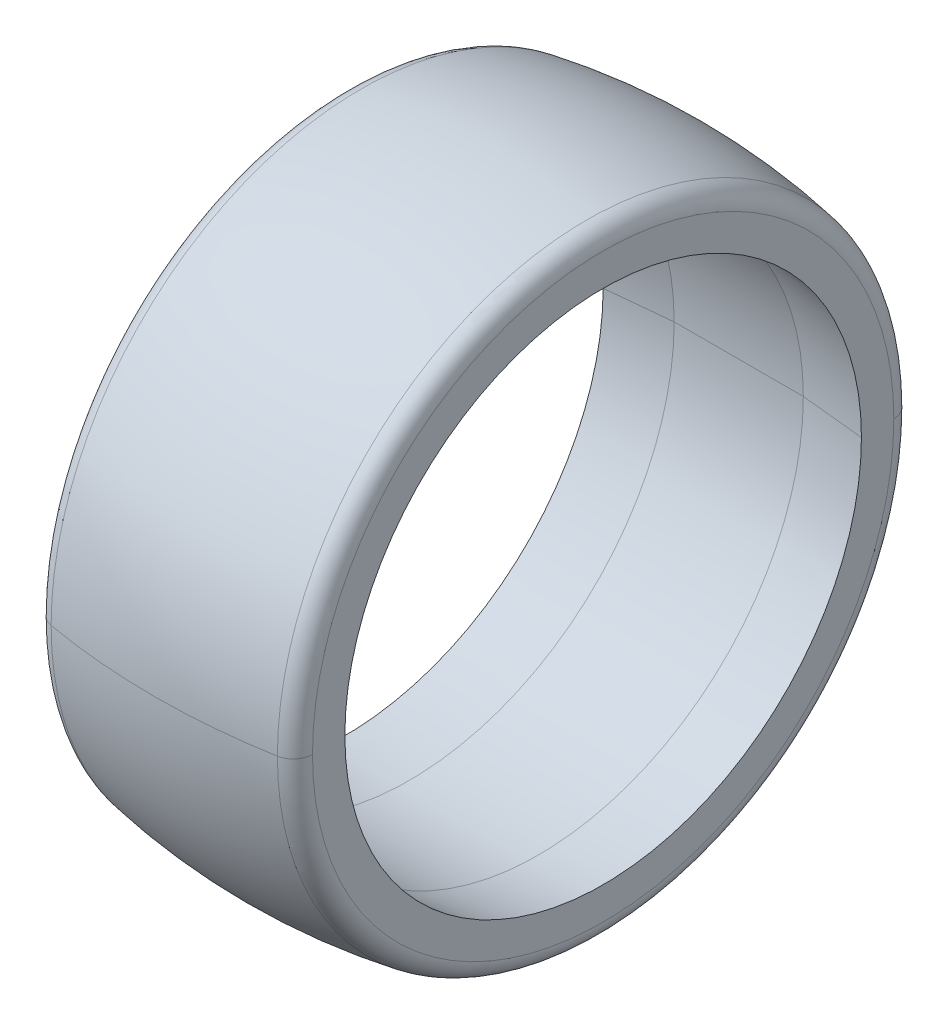
ISO-10303-21;
HEADER;
FILE_DESCRIPTION(('STEP AP214'),'2;1');
FILE_NAME('part.step','',(''),(''),'','','');
FILE_SCHEMA(('AUTOMOTIVE_DESIGN { 1 0 10303 214 1 1 1 1 }'));
ENDSEC;
DATA;
#1=APPLICATION_CONTEXT('core data for automotive mechanical design processes');
#2=APPLICATION_PROTOCOL_DEFINITION('international standard','automotive_design',2000,#1);
#3=PRODUCT_CONTEXT('',#1,'mechanical');
#4=PRODUCT('Part','Part','',(#3));
#5=PRODUCT_RELATED_PRODUCT_CATEGORY('part','',(#4));
#6=PRODUCT_DEFINITION_FORMATION('','',#4);
#7=PRODUCT_DEFINITION_CONTEXT('part definition',#1,'design');
#8=PRODUCT_DEFINITION('design','',#6,#7);
#9=PRODUCT_DEFINITION_SHAPE('','',#8);
#10=(LENGTH_UNIT() NAMED_UNIT(*) SI_UNIT(.MILLI.,.METRE.));
#11=(NAMED_UNIT(*) PLANE_ANGLE_UNIT() SI_UNIT($,.RADIAN.));
#12=(NAMED_UNIT(*) SI_UNIT($,.STERADIAN.) SOLID_ANGLE_UNIT());
#13=UNCERTAINTY_MEASURE_WITH_UNIT(LENGTH_MEASURE(1.E-05),#10,'distance_accuracy_value','');
#14=(GEOMETRIC_REPRESENTATION_CONTEXT(3) GLOBAL_UNCERTAINTY_ASSIGNED_CONTEXT((#13)) GLOBAL_UNIT_ASSIGNED_CONTEXT((#10,
#11,#12)) REPRESENTATION_CONTEXT('',''));
#15=CARTESIAN_POINT('',(0.,0.,0.));
#16=DIRECTION('',(0.,0.,1.));
#17=DIRECTION('',(1.,0.,0.));
#18=AXIS2_PLACEMENT_3D('',#15,#16,#17);
#19=CARTESIAN_POINT('',(-8.5,0.,0.));
#20=DIRECTION('',(1.,0.,0.));
#21=DIRECTION('',(0.,0.,-1.));
#22=AXIS2_PLACEMENT_3D('',#19,#20,#21);
#23=TOROIDAL_SURFACE('',#22,22.5071238264362,1.5);
#24=CARTESIAN_POINT('',(-8.5,0.,22.5071238264362));
#25=DIRECTION('',(0.,1.,0.));
#26=DIRECTION('',(0.,0.,1.));
#27=AXIS2_PLACEMENT_3D('',#24,#25,#26);
#28=CIRCLE('',#27,1.5);
#29=CARTESIAN_POINT('',(-10.,0.,22.5071238264362));
#30=VERTEX_POINT('',#29);
#31=CARTESIAN_POINT('',(-8.76020408163265,0.,23.9843827190823));
#32=VERTEX_POINT('',#31);
#33=EDGE_CURVE('E182',#30,#32,#28,.T.);
#34=ORIENTED_EDGE('',*,*,#33,.F.);
#35=CARTESIAN_POINT('',(-10.,0.,0.));
#36=DIRECTION('',(-1.,0.,0.));
#37=DIRECTION('',(0.,0.,-1.));
#38=AXIS2_PLACEMENT_3D('',#35,#36,#37);
#39=CIRCLE('',#38,22.5071238264362);
#40=CARTESIAN_POINT('',(-10.,0.,-22.5071238264362));
#41=VERTEX_POINT('',#40);
#42=EDGE_CURVE('E160',#41,#30,#39,.T.);
#43=ORIENTED_EDGE('',*,*,#42,.F.);
#44=CARTESIAN_POINT('',(-8.5,0.,-22.5071238264362));
#45=DIRECTION('',(0.,-1.,0.));
#46=DIRECTION('',(0.,0.,-1.));
#47=AXIS2_PLACEMENT_3D('',#44,#45,#46);
#48=CIRCLE('',#47,1.5);
#49=CARTESIAN_POINT('',(-8.76020408163265,0.,-23.9843827190823));
#50=VERTEX_POINT('',#49);
#51=EDGE_CURVE('E187',#41,#50,#48,.T.);
#52=ORIENTED_EDGE('',*,*,#51,.T.);
#53=CARTESIAN_POINT('',(-8.76020408163265,0.,0.));
#54=DIRECTION('',(1.,0.,0.));
#55=DIRECTION('',(0.,0.,-1.));
#56=AXIS2_PLACEMENT_3D('',#53,#54,#55);
#57=CIRCLE('',#56,23.9843827190823);
#58=EDGE_CURVE('E11',#32,#50,#57,.T.);
#59=ORIENTED_EDGE('',*,*,#58,.F.);
#60=EDGE_LOOP('',(#34,#43,#52,#59));
#61=FACE_BOUND('',#60,.T.);
#62=ADVANCED_FACE('F16',(#61),#23,.T.);
#63=CARTESIAN_POINT('',(8.5,0.,0.));
#64=DIRECTION('',(-1.,0.,0.));
#65=DIRECTION('',(0.,0.,1.));
#66=AXIS2_PLACEMENT_3D('',#63,#64,#65);
#67=TOROIDAL_SURFACE('',#66,22.5071238264362,1.5);
#68=CARTESIAN_POINT('',(8.5,0.,-22.5071238264362));
#69=DIRECTION('',(0.,1.,0.));
#70=DIRECTION('',(0.,0.,1.));
#71=AXIS2_PLACEMENT_3D('',#68,#69,#70);
#72=CIRCLE('',#71,1.5);
#73=CARTESIAN_POINT('',(10.,0.,-22.5071238264362));
#74=VERTEX_POINT('',#73);
#75=CARTESIAN_POINT('',(8.76020408163265,0.,-23.9843827190823));
#76=VERTEX_POINT('',#75);
#77=EDGE_CURVE('E193',#74,#76,#72,.T.);
#78=ORIENTED_EDGE('',*,*,#77,.F.);
#79=CARTESIAN_POINT('',(10.,0.,0.));
#80=DIRECTION('',(1.,0.,0.));
#81=DIRECTION('',(0.,0.,1.));
#82=AXIS2_PLACEMENT_3D('',#79,#80,#81);
#83=CIRCLE('',#82,22.5071238264362);
#84=CARTESIAN_POINT('',(10.,0.,22.5071238264362));
#85=VERTEX_POINT('',#84);
#86=EDGE_CURVE('E162',#85,#74,#83,.T.);
#87=ORIENTED_EDGE('',*,*,#86,.F.);
#88=CARTESIAN_POINT('',(8.5,0.,22.5071238264362));
#89=DIRECTION('',(0.,-1.,0.));
#90=DIRECTION('',(0.,0.,-1.));
#91=AXIS2_PLACEMENT_3D('',#88,#89,#90);
#92=CIRCLE('',#91,1.5);
#93=CARTESIAN_POINT('',(8.76020408163265,0.,23.9843827190823));
#94=VERTEX_POINT('',#93);
#95=EDGE_CURVE('E200',#85,#94,#92,.T.);
#96=ORIENTED_EDGE('',*,*,#95,.T.);
#97=CARTESIAN_POINT('',(8.76020408163265,0.,0.));
#98=DIRECTION('',(-1.,0.,0.));
#99=DIRECTION('',(0.,0.,1.));
#100=AXIS2_PLACEMENT_3D('',#97,#98,#99);
#101=CIRCLE('',#100,23.9843827190823);
#102=EDGE_CURVE('E26',#76,#94,#101,.T.);
#103=ORIENTED_EDGE('',*,*,#102,.F.);
#104=EDGE_LOOP('',(#78,#87,#96,#103));
#105=FACE_BOUND('',#104,.T.);
#106=ADVANCED_FACE('F18',(#105),#67,.T.);
#107=CARTESIAN_POINT('',(0.,0.,0.));
#108=DIRECTION('',(-1.,0.,0.));
#109=DIRECTION('',(0.,0.,-1.));
#110=AXIS2_PLACEMENT_3D('',#107,#108,#109);
#111=DEGENERATE_TOROIDAL_SURFACE('',#110,25.75,50.5,.F.);
#112=CARTESIAN_POINT('',(0.,0.,25.75));
#113=DIRECTION('',(0.,1.,0.));
#114=DIRECTION('',(0.,0.,1.));
#115=AXIS2_PLACEMENT_3D('',#112,#113,#114);
#116=CIRCLE('',#115,50.5);
#117=EDGE_CURVE('E195',#76,#50,#116,.T.);
#118=ORIENTED_EDGE('',*,*,#117,.F.);
#119=ORIENTED_EDGE('',*,*,#102,.T.);
#120=CARTESIAN_POINT('',(0.,0.,-25.75));
#121=DIRECTION('',(0.,-1.,0.));
#122=DIRECTION('',(0.,0.,-1.));
#123=AXIS2_PLACEMENT_3D('',#120,#121,#122);
#124=CIRCLE('',#123,50.5);
#125=EDGE_CURVE('E199',#94,#32,#124,.T.);
#126=ORIENTED_EDGE('',*,*,#125,.T.);
#127=ORIENTED_EDGE('',*,*,#58,.T.);
#128=EDGE_LOOP('',(#118,#119,#126,#127));
#129=FACE_BOUND('',#128,.T.);
#130=ADVANCED_FACE('F252',(#129),#111,.F.);
#131=CARTESIAN_POINT('',(10.,20.,0.));
#132=DIRECTION('',(-1.,0.,0.));
#133=DIRECTION('',(0.,0.,1.));
#134=AXIS2_PLACEMENT_3D('',#131,#132,#133);
#135=PLANE('',#134);
#136=CARTESIAN_POINT('',(10.,0.,0.));
#137=DIRECTION('',(-1.,0.,0.));
#138=DIRECTION('',(0.,0.,1.));
#139=AXIS2_PLACEMENT_3D('',#136,#137,#138);
#140=CIRCLE('',#139,20.);
#141=CARTESIAN_POINT('',(10.,0.,20.));
#142=VERTEX_POINT('',#141);
#143=CARTESIAN_POINT('',(10.,0.,-20.));
#144=VERTEX_POINT('',#143);
#145=EDGE_CURVE('E40',#142,#144,#140,.T.);
#146=ORIENTED_EDGE('',*,*,#145,.T.);
#147=CARTESIAN_POINT('',(10.,0.,0.));
#148=DIRECTION('',(-1.,0.,0.));
#149=DIRECTION('',(0.,0.,1.));
#150=AXIS2_PLACEMENT_3D('',#147,#148,#149);
#151=CIRCLE('',#150,20.);
#152=EDGE_CURVE('E149',#144,#142,#151,.T.);
#153=ORIENTED_EDGE('',*,*,#152,.T.);
#154=EDGE_LOOP('',(#146,#153));
#155=FACE_BOUND('',#154,.T.);
#156=ORIENTED_EDGE('',*,*,#86,.T.);
#157=CARTESIAN_POINT('',(10.,0.,0.));
#158=DIRECTION('',(1.,0.,0.));
#159=DIRECTION('',(0.,0.,1.));
#160=AXIS2_PLACEMENT_3D('',#157,#158,#159);
#161=CIRCLE('',#160,22.5071238264362);
#162=EDGE_CURVE('E191',#74,#85,#161,.T.);
#163=ORIENTED_EDGE('',*,*,#162,.T.);
#164=EDGE_LOOP('',(#156,#163));
#165=FACE_BOUND('',#164,.T.);
#166=ADVANCED_FACE('F258',(#155,#165),#135,.F.);
#167=CARTESIAN_POINT('',(-10.,23.75,0.));
#168=DIRECTION('',(1.,0.,0.));
#169=DIRECTION('',(0.,1.,0.));
#170=AXIS2_PLACEMENT_3D('',#167,#168,#169);
#171=PLANE('',#170);
#172=CARTESIAN_POINT('',(-10.,0.,0.));
#173=DIRECTION('',(-1.,0.,0.));
#174=DIRECTION('',(0.,0.,1.));
#175=AXIS2_PLACEMENT_3D('',#172,#173,#174);
#176=CIRCLE('',#175,20.);
#177=CARTESIAN_POINT('',(-10.,0.,-20.));
#178=VERTEX_POINT('',#177);
#179=CARTESIAN_POINT('',(-10.,0.,20.));
#180=VERTEX_POINT('',#179);
#181=EDGE_CURVE('E144',#178,#180,#176,.T.);
#182=ORIENTED_EDGE('',*,*,#181,.F.);
#183=CARTESIAN_POINT('',(-10.,0.,0.));
#184=DIRECTION('',(-1.,0.,0.));
#185=DIRECTION('',(0.,0.,1.));
#186=AXIS2_PLACEMENT_3D('',#183,#184,#185);
#187=CIRCLE('',#186,20.);
#188=EDGE_CURVE('E84',#180,#178,#187,.T.);
#189=ORIENTED_EDGE('',*,*,#188,.F.);
#190=EDGE_LOOP('',(#182,#189));
#191=FACE_BOUND('',#190,.T.);
#192=ORIENTED_EDGE('',*,*,#42,.T.);
#193=CARTESIAN_POINT('',(-10.,0.,0.));
#194=DIRECTION('',(-1.,0.,0.));
#195=DIRECTION('',(0.,0.,-1.));
#196=AXIS2_PLACEMENT_3D('',#193,#194,#195);
#197=CIRCLE('',#196,22.5071238264362);
#198=EDGE_CURVE('E179',#30,#41,#197,.T.);
#199=ORIENTED_EDGE('',*,*,#198,.T.);
#200=EDGE_LOOP('',(#192,#199));
#201=FACE_BOUND('',#200,.T.);
#202=ADVANCED_FACE('F256',(#191,#201),#171,.F.);
#203=CARTESIAN_POINT('',(-10.,0.,0.));
#204=DIRECTION('',(1.,0.,0.));
#205=DIRECTION('',(0.,0.,-1.));
#206=AXIS2_PLACEMENT_3D('',#203,#204,#205);
#207=CONICAL_SURFACE('',#206,20.,0.0996686524911618);
#208=DIRECTION('',(0.995037190209989,0.,0.099503719020999));
#209=VECTOR('',#208,1.);
#210=CARTESIAN_POINT('',(-10.,0.,20.));
#211=LINE('',#210,#209);
#212=CARTESIAN_POINT('',(-5.,0.,20.5));
#213=VERTEX_POINT('',#212);
#214=EDGE_CURVE('E137',#180,#213,#211,.T.);
#215=ORIENTED_EDGE('',*,*,#214,.F.);
#216=ORIENTED_EDGE('',*,*,#188,.T.);
#217=DIRECTION('',(0.995037190209989,0.,-0.099503719020999));
#218=VECTOR('',#217,1.);
#219=CARTESIAN_POINT('',(-10.,0.,-20.));
#220=LINE('',#219,#218);
#221=CARTESIAN_POINT('',(-5.,0.,-20.5));
#222=VERTEX_POINT('',#221);
#223=EDGE_CURVE('E130',#178,#222,#220,.T.);
#224=ORIENTED_EDGE('',*,*,#223,.T.);
#225=CARTESIAN_POINT('',(-5.,0.,0.));
#226=DIRECTION('',(-1.,0.,0.));
#227=DIRECTION('',(0.,0.,1.));
#228=AXIS2_PLACEMENT_3D('',#225,#226,#227);
#229=CIRCLE('',#228,20.5);
#230=EDGE_CURVE('E110',#213,#222,#229,.T.);
#231=ORIENTED_EDGE('',*,*,#230,.F.);
#232=EDGE_LOOP('',(#215,#216,#224,#231));
#233=FACE_BOUND('',#232,.T.);
#234=ADVANCED_FACE('F131',(#233),#207,.F.);
#235=CARTESIAN_POINT('',(-34.5743492963119,0.,0.));
#236=DIRECTION('',(-1.,0.,0.));
#237=DIRECTION('',(0.,0.,1.));
#238=AXIS2_PLACEMENT_3D('',#235,#236,#237);
#239=CYLINDRICAL_SURFACE('',#238,20.5);
#240=DIRECTION('',(-1.,0.,0.));
#241=VECTOR('',#240,1.);
#242=CARTESIAN_POINT('',(-34.5743492963119,0.,-20.5));
#243=LINE('',#242,#241);
#244=CARTESIAN_POINT('',(5.,0.,-20.5));
#245=VERTEX_POINT('',#244);
#246=EDGE_CURVE('E113',#245,#222,#243,.T.);
#247=ORIENTED_EDGE('',*,*,#246,.F.);
#248=CARTESIAN_POINT('',(5.,0.,0.));
#249=DIRECTION('',(-1.,0.,0.));
#250=DIRECTION('',(0.,0.,1.));
#251=AXIS2_PLACEMENT_3D('',#248,#249,#250);
#252=CIRCLE('',#251,20.5);
#253=CARTESIAN_POINT('',(5.,0.,20.5));
#254=VERTEX_POINT('',#253);
#255=EDGE_CURVE('E119',#254,#245,#252,.T.);
#256=ORIENTED_EDGE('',*,*,#255,.F.);
#257=DIRECTION('',(-1.,0.,0.));
#258=VECTOR('',#257,1.);
#259=CARTESIAN_POINT('',(-34.5743492963119,0.,20.5));
#260=LINE('',#259,#258);
#261=EDGE_CURVE('E116',#254,#213,#260,.T.);
#262=ORIENTED_EDGE('',*,*,#261,.T.);
#263=ORIENTED_EDGE('',*,*,#230,.T.);
#264=EDGE_LOOP('',(#247,#256,#262,#263));
#265=FACE_BOUND('',#264,.T.);
#266=ADVANCED_FACE('F112',(#265),#239,.F.);
#267=CARTESIAN_POINT('',(5.,0.,0.));
#268=DIRECTION('',(-1.,0.,0.));
#269=DIRECTION('',(0.,0.,1.));
#270=AXIS2_PLACEMENT_3D('',#267,#268,#269);
#271=CONICAL_SURFACE('',#270,20.5,0.0996686524911618);
#272=DIRECTION('',(-0.995037190209989,0.,-0.0995037190209989));
#273=VECTOR('',#272,1.);
#274=CARTESIAN_POINT('',(5.,0.,-20.5));
#275=LINE('',#274,#273);
#276=EDGE_CURVE('E153',#144,#245,#275,.T.);
#277=ORIENTED_EDGE('',*,*,#276,.F.);
#278=ORIENTED_EDGE('',*,*,#145,.F.);
#279=DIRECTION('',(-0.995037190209989,0.,0.0995037190209989));
#280=VECTOR('',#279,1.);
#281=CARTESIAN_POINT('',(5.,0.,20.5));
#282=LINE('',#281,#280);
#283=EDGE_CURVE('E150',#142,#254,#282,.T.);
#284=ORIENTED_EDGE('',*,*,#283,.T.);
#285=ORIENTED_EDGE('',*,*,#255,.T.);
#286=EDGE_LOOP('',(#277,#278,#284,#285));
#287=FACE_BOUND('',#286,.T.);
#288=ADVANCED_FACE('F232',(#287),#271,.F.);
#289=CARTESIAN_POINT('',(5.,0.,0.));
#290=DIRECTION('',(-1.,0.,0.));
#291=DIRECTION('',(0.,0.,1.));
#292=AXIS2_PLACEMENT_3D('',#289,#290,#291);
#293=CONICAL_SURFACE('',#292,20.5,0.0996686524911618);
#294=ORIENTED_EDGE('',*,*,#152,.F.);
#295=ORIENTED_EDGE('',*,*,#276,.T.);
#296=CARTESIAN_POINT('',(5.,0.,0.));
#297=DIRECTION('',(-1.,0.,0.));
#298=DIRECTION('',(0.,0.,1.));
#299=AXIS2_PLACEMENT_3D('',#296,#297,#298);
#300=CIRCLE('',#299,20.5);
#301=EDGE_CURVE('E127',#245,#254,#300,.T.);
#302=ORIENTED_EDGE('',*,*,#301,.T.);
#303=ORIENTED_EDGE('',*,*,#283,.F.);
#304=EDGE_LOOP('',(#294,#295,#302,#303));
#305=FACE_BOUND('',#304,.T.);
#306=ADVANCED_FACE('F231',(#305),#293,.F.);
#307=CARTESIAN_POINT('',(-34.5743492963119,0.,0.));
#308=DIRECTION('',(-1.,0.,0.));
#309=DIRECTION('',(0.,0.,1.));
#310=AXIS2_PLACEMENT_3D('',#307,#308,#309);
#311=CYLINDRICAL_SURFACE('',#310,20.5);
#312=ORIENTED_EDGE('',*,*,#301,.F.);
#313=ORIENTED_EDGE('',*,*,#246,.T.);
#314=CARTESIAN_POINT('',(-5.,0.,0.));
#315=DIRECTION('',(-1.,0.,0.));
#316=DIRECTION('',(0.,0.,1.));
#317=AXIS2_PLACEMENT_3D('',#314,#315,#316);
#318=CIRCLE('',#317,20.5);
#319=EDGE_CURVE('E124',#222,#213,#318,.T.);
#320=ORIENTED_EDGE('',*,*,#319,.T.);
#321=ORIENTED_EDGE('',*,*,#261,.F.);
#322=EDGE_LOOP('',(#312,#313,#320,#321));
#323=FACE_BOUND('',#322,.T.);
#324=ADVANCED_FACE('F122',(#323),#311,.F.);
#325=CARTESIAN_POINT('',(-10.,0.,0.));
#326=DIRECTION('',(1.,0.,0.));
#327=DIRECTION('',(0.,0.,-1.));
#328=AXIS2_PLACEMENT_3D('',#325,#326,#327);
#329=CONICAL_SURFACE('',#328,20.,0.0996686524911618);
#330=ORIENTED_EDGE('',*,*,#181,.T.);
#331=ORIENTED_EDGE('',*,*,#214,.T.);
#332=ORIENTED_EDGE('',*,*,#319,.F.);
#333=ORIENTED_EDGE('',*,*,#223,.F.);
#334=EDGE_LOOP('',(#330,#331,#332,#333));
#335=FACE_BOUND('',#334,.T.);
#336=ADVANCED_FACE('F136',(#335),#329,.F.);
#337=CARTESIAN_POINT('',(0.,0.,0.));
#338=DIRECTION('',(-1.,0.,0.));
#339=DIRECTION('',(0.,0.,-1.));
#340=AXIS2_PLACEMENT_3D('',#337,#338,#339);
#341=DEGENERATE_TOROIDAL_SURFACE('',#340,25.75,50.5,.F.);
#342=CARTESIAN_POINT('',(8.76020408163265,0.,0.));
#343=DIRECTION('',(-1.,0.,0.));
#344=DIRECTION('',(0.,0.,1.));
#345=AXIS2_PLACEMENT_3D('',#342,#343,#344);
#346=CIRCLE('',#345,23.9843827190823);
#347=EDGE_CURVE('E204',#94,#76,#346,.T.);
#348=ORIENTED_EDGE('',*,*,#347,.T.);
#349=ORIENTED_EDGE('',*,*,#117,.T.);
#350=CARTESIAN_POINT('',(-8.76020408163265,0.,0.));
#351=DIRECTION('',(1.,0.,0.));
#352=DIRECTION('',(0.,0.,-1.));
#353=AXIS2_PLACEMENT_3D('',#350,#351,#352);
#354=CIRCLE('',#353,23.9843827190823);
#355=EDGE_CURVE('E186',#50,#32,#354,.T.);
#356=ORIENTED_EDGE('',*,*,#355,.T.);
#357=ORIENTED_EDGE('',*,*,#125,.F.);
#358=EDGE_LOOP('',(#348,#349,#356,#357));
#359=FACE_BOUND('',#358,.T.);
#360=ADVANCED_FACE('F417',(#359),#341,.F.);
#361=CARTESIAN_POINT('',(8.5,0.,0.));
#362=DIRECTION('',(-1.,0.,0.));
#363=DIRECTION('',(0.,0.,1.));
#364=AXIS2_PLACEMENT_3D('',#361,#362,#363);
#365=TOROIDAL_SURFACE('',#364,22.5071238264362,1.5);
#366=ORIENTED_EDGE('',*,*,#162,.F.);
#367=ORIENTED_EDGE('',*,*,#77,.T.);
#368=ORIENTED_EDGE('',*,*,#347,.F.);
#369=ORIENTED_EDGE('',*,*,#95,.F.);
#370=EDGE_LOOP('',(#366,#367,#368,#369));
#371=FACE_BOUND('',#370,.T.);
#372=ADVANCED_FACE('F422',(#371),#365,.T.);
#373=CARTESIAN_POINT('',(-8.5,0.,0.));
#374=DIRECTION('',(1.,0.,0.));
#375=DIRECTION('',(0.,0.,-1.));
#376=AXIS2_PLACEMENT_3D('',#373,#374,#375);
#377=TOROIDAL_SURFACE('',#376,22.5071238264362,1.5);
#378=ORIENTED_EDGE('',*,*,#198,.F.);
#379=ORIENTED_EDGE('',*,*,#33,.T.);
#380=ORIENTED_EDGE('',*,*,#355,.F.);
#381=ORIENTED_EDGE('',*,*,#51,.F.);
#382=EDGE_LOOP('',(#378,#379,#380,#381));
#383=FACE_BOUND('',#382,.T.);
#384=ADVANCED_FACE('F424',(#383),#377,.T.);
#385=CLOSED_SHELL('',(#62,#106,#130,#166,#202,#234,#266,#288,#306,#324,#336,#360,#372,#384));
#386=MANIFOLD_SOLID_BREP('B1',#385);
#387=ADVANCED_BREP_SHAPE_REPRESENTATION('',(#18,#386),#14);
#388=SHAPE_DEFINITION_REPRESENTATION(#9,#387);
ENDSEC;
END-ISO-10303-21;
